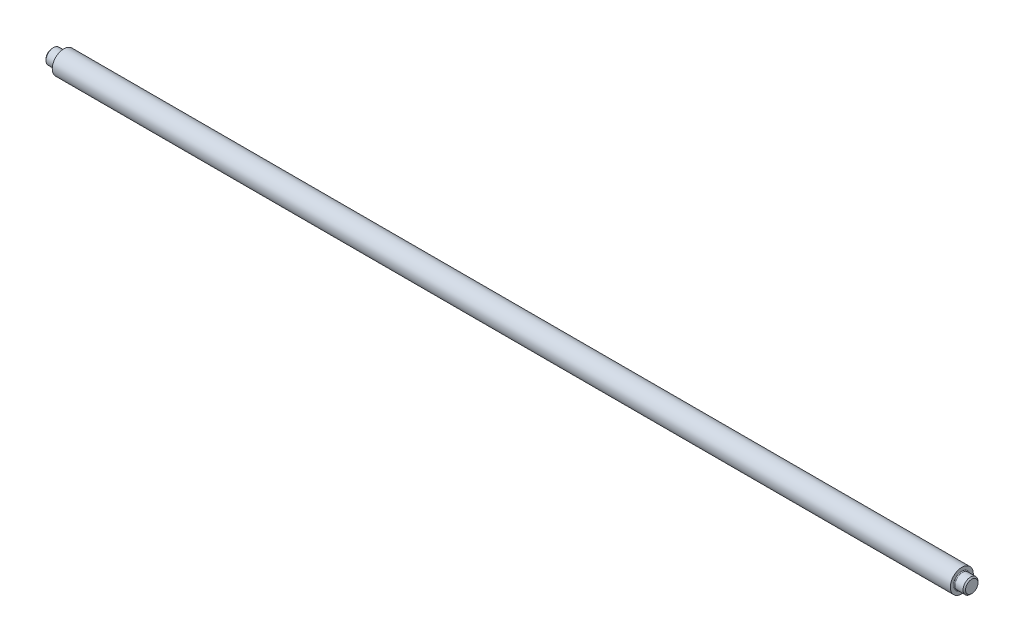
ISO-10303-21;
HEADER;
FILE_DESCRIPTION(('STEP AP214'),'2;1');
FILE_NAME('part.step','',(''),(''),'','','');
FILE_SCHEMA(('AUTOMOTIVE_DESIGN { 1 0 10303 214 1 1 1 1 }'));
ENDSEC;
DATA;
#1=APPLICATION_CONTEXT('core data for automotive mechanical design processes');
#2=APPLICATION_PROTOCOL_DEFINITION('international standard','automotive_design',2000,#1);
#3=PRODUCT_CONTEXT('',#1,'mechanical');
#4=PRODUCT('Part','Part','',(#3));
#5=PRODUCT_RELATED_PRODUCT_CATEGORY('part','',(#4));
#6=PRODUCT_DEFINITION_FORMATION('','',#4);
#7=PRODUCT_DEFINITION_CONTEXT('part definition',#1,'design');
#8=PRODUCT_DEFINITION('design','',#6,#7);
#9=PRODUCT_DEFINITION_SHAPE('','',#8);
#10=(LENGTH_UNIT() NAMED_UNIT(*) SI_UNIT(.MILLI.,.METRE.));
#11=(NAMED_UNIT(*) PLANE_ANGLE_UNIT() SI_UNIT($,.RADIAN.));
#12=(NAMED_UNIT(*) SI_UNIT($,.STERADIAN.) SOLID_ANGLE_UNIT());
#13=UNCERTAINTY_MEASURE_WITH_UNIT(LENGTH_MEASURE(1.E-05),#10,'distance_accuracy_value','');
#14=(GEOMETRIC_REPRESENTATION_CONTEXT(3) GLOBAL_UNCERTAINTY_ASSIGNED_CONTEXT((#13)) GLOBAL_UNIT_ASSIGNED_CONTEXT((#10,
#11,#12)) REPRESENTATION_CONTEXT('',''));
#15=CARTESIAN_POINT('',(0.,0.,0.));
#16=DIRECTION('',(0.,0.,1.));
#17=DIRECTION('',(1.,0.,0.));
#18=AXIS2_PLACEMENT_3D('',#15,#16,#17);
#19=CARTESIAN_POINT('',(4.,3.3,0.));
#20=DIRECTION('',(-1.,0.,0.));
#21=DIRECTION('',(0.,0.,1.));
#22=AXIS2_PLACEMENT_3D('',#19,#20,#21);
#23=PLANE('',#22);
#24=CARTESIAN_POINT('',(4.,0.,0.));
#25=DIRECTION('',(-1.,0.,0.));
#26=DIRECTION('',(0.,0.,1.));
#27=AXIS2_PLACEMENT_3D('',#24,#25,#26);
#28=CIRCLE('',#27,3.3);
#29=CARTESIAN_POINT('',(4.,0.,3.3));
#30=VERTEX_POINT('',#29);
#31=EDGE_CURVE('E11',#30,#30,#28,.T.);
#32=ORIENTED_EDGE('',*,*,#31,.F.);
#33=EDGE_LOOP('',(#32));
#34=FACE_BOUND('',#33,.T.);
#35=ADVANCED_FACE('F43',(#34),#23,.F.);
#36=CARTESIAN_POINT('',(3.70000000000012,0.,0.));
#37=DIRECTION('',(-1.,0.,0.));
#38=DIRECTION('',(0.,0.,1.));
#39=AXIS2_PLACEMENT_3D('',#36,#37,#38);
#40=TOROIDAL_SURFACE('',#39,3.29999999999988,0.299999999999877);
#41=CARTESIAN_POINT('',(3.7,0.,0.));
#42=DIRECTION('',(-1.,0.,0.));
#43=DIRECTION('',(0.,0.,1.));
#44=AXIS2_PLACEMENT_3D('',#41,#42,#43);
#45=CIRCLE('',#44,3.);
#46=CARTESIAN_POINT('',(3.7,0.,3.));
#47=VERTEX_POINT('',#46);
#48=EDGE_CURVE('E49',#47,#47,#45,.T.);
#49=ORIENTED_EDGE('',*,*,#48,.F.);
#50=EDGE_LOOP('',(#49));
#51=FACE_BOUND('',#50,.T.);
#52=ORIENTED_EDGE('',*,*,#31,.T.);
#53=EDGE_LOOP('',(#52));
#54=FACE_BOUND('',#53,.T.);
#55=ADVANCED_FACE('F73',(#51,#54),#40,.F.);
#56=CARTESIAN_POINT('',(4.,0.,0.));
#57=DIRECTION('',(-1.,0.,0.));
#58=DIRECTION('',(0.,0.,1.));
#59=AXIS2_PLACEMENT_3D('',#56,#57,#58);
#60=CYLINDRICAL_SURFACE('',#59,3.);
#61=CARTESIAN_POINT('',(0.5,0.,0.));
#62=DIRECTION('',(-1.,0.,0.));
#63=DIRECTION('',(0.,0.,1.));
#64=AXIS2_PLACEMENT_3D('',#61,#62,#63);
#65=CIRCLE('',#64,3.);
#66=CARTESIAN_POINT('',(0.5,0.,3.));
#67=VERTEX_POINT('',#66);
#68=EDGE_CURVE('E53',#67,#67,#65,.T.);
#69=ORIENTED_EDGE('',*,*,#68,.F.);
#70=EDGE_LOOP('',(#69));
#71=FACE_BOUND('',#70,.T.);
#72=ORIENTED_EDGE('',*,*,#48,.T.);
#73=EDGE_LOOP('',(#72));
#74=FACE_BOUND('',#73,.T.);
#75=ADVANCED_FACE('F68',(#71,#74),#60,.T.);
#76=CARTESIAN_POINT('',(0.5,0.,0.));
#77=DIRECTION('',(1.,0.,0.));
#78=DIRECTION('',(0.,0.,-1.));
#79=AXIS2_PLACEMENT_3D('',#76,#77,#78);
#80=CONICAL_SURFACE('',#79,3.,0.785398163397448);
#81=CARTESIAN_POINT('',(0.,0.,0.));
#82=DIRECTION('',(-1.,0.,0.));
#83=DIRECTION('',(0.,0.,1.));
#84=AXIS2_PLACEMENT_3D('',#81,#82,#83);
#85=CIRCLE('',#84,2.5);
#86=CARTESIAN_POINT('',(0.,0.,2.5));
#87=VERTEX_POINT('',#86);
#88=EDGE_CURVE('E57',#87,#87,#85,.T.);
#89=ORIENTED_EDGE('',*,*,#88,.F.);
#90=EDGE_LOOP('',(#89));
#91=FACE_BOUND('',#90,.T.);
#92=ORIENTED_EDGE('',*,*,#68,.T.);
#93=EDGE_LOOP('',(#92));
#94=FACE_BOUND('',#93,.T.);
#95=ADVANCED_FACE('F65',(#91,#94),#80,.T.);
#96=CARTESIAN_POINT('',(0.,0.,0.));
#97=DIRECTION('',(1.,0.,0.));
#98=DIRECTION('',(0.,0.,-1.));
#99=AXIS2_PLACEMENT_3D('',#96,#97,#98);
#100=PLANE('',#99);
#101=ORIENTED_EDGE('',*,*,#88,.T.);
#102=EDGE_LOOP('',(#101));
#103=FACE_BOUND('',#102,.T.);
#104=ADVANCED_FACE('F63',(#103),#100,.F.);
#105=CLOSED_SHELL('',(#35,#55,#75,#95,#104));
#106=MANIFOLD_SOLID_BREP('B2',#105);
#107=CARTESIAN_POINT('',(4.61538461538461,0.,0.));
#108=DIRECTION('',(1.,0.,0.));
#109=DIRECTION('',(0.,0.,-1.));
#110=AXIS2_PLACEMENT_3D('',#107,#108,#109);
#111=PLANE('',#110);
#112=CARTESIAN_POINT('',(4.61538461538463,0.,0.));
#113=DIRECTION('',(-1.,0.,0.));
#114=DIRECTION('',(0.,0.,1.));
#115=AXIS2_PLACEMENT_3D('',#112,#113,#114);
#116=CIRCLE('',#115,4.61538461538461);
#117=CARTESIAN_POINT('',(4.61538461538463,0.,4.61538461538461));
#118=VERTEX_POINT('',#117);
#119=EDGE_CURVE('E42',#118,#118,#116,.T.);
#120=ORIENTED_EDGE('',*,*,#119,.T.);
#121=EDGE_LOOP('',(#120));
#122=FACE_BOUND('',#121,.T.);
#123=ADVANCED_FACE('F114',(#122),#111,.F.);
#124=CARTESIAN_POINT('',(364.615384615385,0.,0.));
#125=DIRECTION('',(-1.,0.,0.));
#126=DIRECTION('',(0.,0.,1.));
#127=AXIS2_PLACEMENT_3D('',#124,#125,#126);
#128=CYLINDRICAL_SURFACE('',#127,4.61538461538461);
#129=ORIENTED_EDGE('',*,*,#119,.F.);
#130=EDGE_LOOP('',(#129));
#131=FACE_BOUND('',#130,.T.);
#132=CARTESIAN_POINT('',(364.615384615385,0.,0.));
#133=DIRECTION('',(-1.,0.,0.));
#134=DIRECTION('',(0.,0.,1.));
#135=AXIS2_PLACEMENT_3D('',#132,#133,#134);
#136=CIRCLE('',#135,4.61538461538461);
#137=CARTESIAN_POINT('',(364.615384615385,0.,4.61538461538461));
#138=VERTEX_POINT('',#137);
#139=EDGE_CURVE('E120',#138,#138,#136,.T.);
#140=ORIENTED_EDGE('',*,*,#139,.T.);
#141=EDGE_LOOP('',(#140));
#142=FACE_BOUND('',#141,.T.);
#143=ADVANCED_FACE('F167',(#131,#142),#128,.T.);
#144=CARTESIAN_POINT('',(364.615384615385,4.61538461538461,0.));
#145=DIRECTION('',(-1.,0.,0.));
#146=DIRECTION('',(0.,0.,1.));
#147=AXIS2_PLACEMENT_3D('',#144,#145,#146);
#148=PLANE('',#147);
#149=CARTESIAN_POINT('',(364.615384615385,0.,0.));
#150=DIRECTION('',(-1.,0.,0.));
#151=DIRECTION('',(0.,0.,1.));
#152=AXIS2_PLACEMENT_3D('',#149,#150,#151);
#153=CIRCLE('',#152,3.3);
#154=CARTESIAN_POINT('',(364.615384615385,0.,3.3));
#155=VERTEX_POINT('',#154);
#156=EDGE_CURVE('E136',#155,#155,#153,.T.);
#157=ORIENTED_EDGE('',*,*,#156,.T.);
#158=EDGE_LOOP('',(#157));
#159=FACE_BOUND('',#158,.T.);
#160=ORIENTED_EDGE('',*,*,#139,.F.);
#161=EDGE_LOOP('',(#160));
#162=FACE_BOUND('',#161,.T.);
#163=ADVANCED_FACE('F140',(#159,#162),#148,.F.);
#164=CARTESIAN_POINT('',(368.615384615385,2.5,0.));
#165=DIRECTION('',(-1.,0.,0.));
#166=DIRECTION('',(0.,0.,1.));
#167=AXIS2_PLACEMENT_3D('',#164,#165,#166);
#168=PLANE('',#167);
#169=CARTESIAN_POINT('',(368.615384615385,0.,0.));
#170=DIRECTION('',(-1.,0.,0.));
#171=DIRECTION('',(0.,0.,1.));
#172=AXIS2_PLACEMENT_3D('',#169,#170,#171);
#173=CIRCLE('',#172,2.5);
#174=CARTESIAN_POINT('',(368.615384615385,0.,2.5));
#175=VERTEX_POINT('',#174);
#176=EDGE_CURVE('E124',#175,#175,#173,.T.);
#177=ORIENTED_EDGE('',*,*,#176,.F.);
#178=EDGE_LOOP('',(#177));
#179=FACE_BOUND('',#178,.T.);
#180=ADVANCED_FACE('F158',(#179),#168,.F.);
#181=CARTESIAN_POINT('',(368.615384615385,0.,0.));
#182=DIRECTION('',(-1.,0.,0.));
#183=DIRECTION('',(0.,0.,1.));
#184=AXIS2_PLACEMENT_3D('',#181,#182,#183);
#185=CONICAL_SURFACE('',#184,2.5,0.785398163397448);
#186=CARTESIAN_POINT('',(368.115384615385,0.,0.));
#187=DIRECTION('',(-1.,0.,0.));
#188=DIRECTION('',(0.,0.,1.));
#189=AXIS2_PLACEMENT_3D('',#186,#187,#188);
#190=CIRCLE('',#189,3.);
#191=CARTESIAN_POINT('',(368.115384615385,0.,3.));
#192=VERTEX_POINT('',#191);
#193=EDGE_CURVE('E128',#192,#192,#190,.T.);
#194=ORIENTED_EDGE('',*,*,#193,.F.);
#195=EDGE_LOOP('',(#194));
#196=FACE_BOUND('',#195,.T.);
#197=ORIENTED_EDGE('',*,*,#176,.T.);
#198=EDGE_LOOP('',(#197));
#199=FACE_BOUND('',#198,.T.);
#200=ADVANCED_FACE('F152',(#196,#199),#185,.T.);
#201=CARTESIAN_POINT('',(368.615384615385,0.,0.));
#202=DIRECTION('',(-1.,0.,0.));
#203=DIRECTION('',(0.,0.,1.));
#204=AXIS2_PLACEMENT_3D('',#201,#202,#203);
#205=CYLINDRICAL_SURFACE('',#204,3.);
#206=CARTESIAN_POINT('',(364.915384615378,0.,0.));
#207=DIRECTION('',(-1.,0.,0.));
#208=DIRECTION('',(0.,0.,1.));
#209=AXIS2_PLACEMENT_3D('',#206,#207,#208);
#210=CIRCLE('',#209,3.);
#211=CARTESIAN_POINT('',(364.915384615378,0.,3.));
#212=VERTEX_POINT('',#211);
#213=EDGE_CURVE('E133',#212,#212,#210,.T.);
#214=ORIENTED_EDGE('',*,*,#213,.F.);
#215=EDGE_LOOP('',(#214));
#216=FACE_BOUND('',#215,.T.);
#217=ORIENTED_EDGE('',*,*,#193,.T.);
#218=EDGE_LOOP('',(#217));
#219=FACE_BOUND('',#218,.T.);
#220=ADVANCED_FACE('F146',(#216,#219),#205,.T.);
#221=CARTESIAN_POINT('',(364.915384615378,0.,0.));
#222=DIRECTION('',(-1.,0.,0.));
#223=DIRECTION('',(0.,0.,1.));
#224=AXIS2_PLACEMENT_3D('',#221,#222,#223);
#225=TOROIDAL_SURFACE('',#224,3.29999999999302,0.299999999993026);
#226=ORIENTED_EDGE('',*,*,#156,.F.);
#227=EDGE_LOOP('',(#226));
#228=FACE_BOUND('',#227,.T.);
#229=ORIENTED_EDGE('',*,*,#213,.T.);
#230=EDGE_LOOP('',(#229));
#231=FACE_BOUND('',#230,.T.);
#232=ADVANCED_FACE('F143',(#228,#231),#225,.F.);
#233=CLOSED_SHELL('',(#123,#143,#163,#180,#200,#220,#232));
#234=MANIFOLD_SOLID_BREP('B6',#233);
#235=ADVANCED_BREP_SHAPE_REPRESENTATION('',(#18,#106,#234),#14);
#236=SHAPE_DEFINITION_REPRESENTATION(#9,#235);
ENDSEC;
END-ISO-10303-21;
